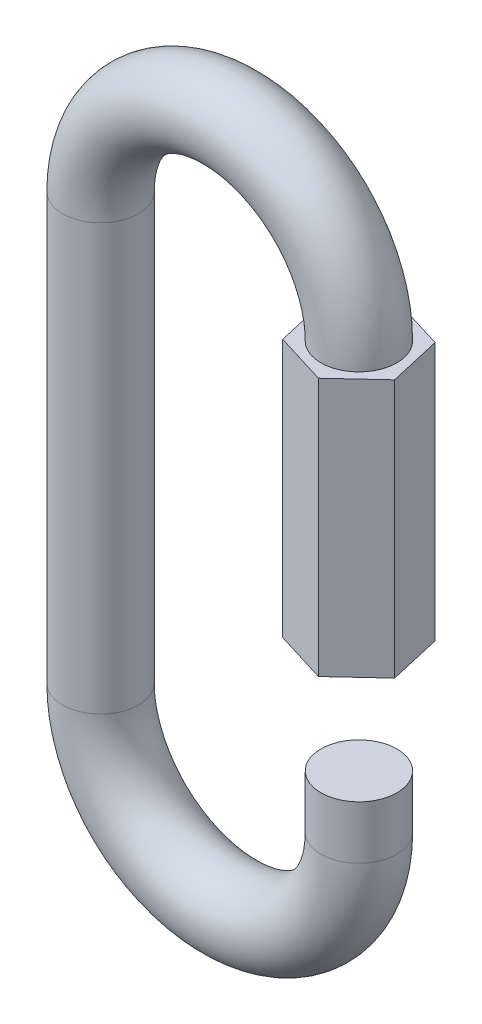
ISO-10303-21;
HEADER;
FILE_DESCRIPTION(('STEP AP214'),'2;1');
FILE_NAME('part.step','',(''),(''),'','','');
FILE_SCHEMA(('AUTOMOTIVE_DESIGN { 1 0 10303 214 1 1 1 1 }'));
ENDSEC;
DATA;
#1=APPLICATION_CONTEXT('core data for automotive mechanical design processes');
#2=APPLICATION_PROTOCOL_DEFINITION('international standard','automotive_design',2000,#1);
#3=PRODUCT_CONTEXT('',#1,'mechanical');
#4=PRODUCT('Part','Part','',(#3));
#5=PRODUCT_RELATED_PRODUCT_CATEGORY('part','',(#4));
#6=PRODUCT_DEFINITION_FORMATION('','',#4);
#7=PRODUCT_DEFINITION_CONTEXT('part definition',#1,'design');
#8=PRODUCT_DEFINITION('design','',#6,#7);
#9=PRODUCT_DEFINITION_SHAPE('','',#8);
#10=(LENGTH_UNIT() NAMED_UNIT(*) SI_UNIT(.MILLI.,.METRE.));
#11=(NAMED_UNIT(*) PLANE_ANGLE_UNIT() SI_UNIT($,.RADIAN.));
#12=(NAMED_UNIT(*) SI_UNIT($,.STERADIAN.) SOLID_ANGLE_UNIT());
#13=UNCERTAINTY_MEASURE_WITH_UNIT(LENGTH_MEASURE(1.E-05),#10,'distance_accuracy_value','');
#14=(GEOMETRIC_REPRESENTATION_CONTEXT(3) GLOBAL_UNCERTAINTY_ASSIGNED_CONTEXT((#13)) GLOBAL_UNIT_ASSIGNED_CONTEXT((#10,
#11,#12)) REPRESENTATION_CONTEXT('',''));
#15=CARTESIAN_POINT('',(0.,0.,0.));
#16=DIRECTION('',(0.,0.,1.));
#17=DIRECTION('',(1.,0.,0.));
#18=AXIS2_PLACEMENT_3D('',#15,#16,#17);
#19=CARTESIAN_POINT('',(0.,-7.5,0.));
#20=DIRECTION('',(0.,1.,0.));
#21=DIRECTION('',(0.,0.,1.));
#22=AXIS2_PLACEMENT_3D('',#19,#20,#21);
#23=PLANE('',#22);
#24=CARTESIAN_POINT('',(0.,-7.5,0.));
#25=DIRECTION('',(0.,1.,0.));
#26=DIRECTION('',(0.,0.,1.));
#27=AXIS2_PLACEMENT_3D('',#24,#25,#26);
#28=CIRCLE('',#27,2.5);
#29=CARTESIAN_POINT('',(0.,-7.5,2.5));
#30=VERTEX_POINT('',#29);
#31=EDGE_CURVE('E11',#30,#30,#28,.T.);
#32=ORIENTED_EDGE('',*,*,#31,.T.);
#33=EDGE_LOOP('',(#32));
#34=FACE_BOUND('',#33,.T.);
#35=ADVANCED_FACE('F39',(#34),#23,.T.);
#36=CARTESIAN_POINT('',(-8.5,17.,0.));
#37=DIRECTION('',(0.,0.,1.));
#38=DIRECTION('',(1.,0.,0.));
#39=AXIS2_PLACEMENT_3D('',#36,#37,#38);
#40=TOROIDAL_SURFACE('',#39,8.5,2.5);
#41=CARTESIAN_POINT('',(0.,17.,0.));
#42=DIRECTION('',(0.,-1.,0.));
#43=DIRECTION('',(0.,0.,-1.));
#44=AXIS2_PLACEMENT_3D('',#41,#42,#43);
#45=CIRCLE('',#44,2.5);
#46=CARTESIAN_POINT('',(2.5,17.,0.));
#47=VERTEX_POINT('',#46);
#48=EDGE_CURVE('E157',#47,#47,#45,.F.);
#49=CARTESIAN_POINT('',(-17.,17.,0.));
#50=DIRECTION('',(0.,-1.,0.));
#51=DIRECTION('',(0.,0.,1.));
#52=AXIS2_PLACEMENT_3D('',#49,#50,#51);
#53=CIRCLE('',#52,2.5);
#54=CARTESIAN_POINT('',(-19.5,17.,0.));
#55=VERTEX_POINT('',#54);
#56=EDGE_CURVE('E170',#55,#55,#53,.T.);
#57=CARTESIAN_POINT('',(-8.5,17.,0.));
#58=DIRECTION('',(0.,0.,1.));
#59=DIRECTION('',(1.,0.,0.));
#60=AXIS2_PLACEMENT_3D('',#57,#58,#59);
#61=CIRCLE('',#60,11.);
#62=EDGE_CURVE('',#47,#55,#61,.T.);
#63=ORIENTED_EDGE('',*,*,#48,.T.);
#64=ORIENTED_EDGE('',*,*,#56,.F.);
#65=ORIENTED_EDGE('',*,*,#62,.T.);
#66=ORIENTED_EDGE('',*,*,#62,.F.);
#67=EDGE_LOOP('',(#63,#65,#64,#66));
#68=FACE_BOUND('',#67,.T.);
#69=ADVANCED_FACE('F192',(#68),#40,.T.);
#70=CARTESIAN_POINT('',(-17.,17.,0.));
#71=DIRECTION('',(0.,-1.,0.));
#72=DIRECTION('',(1.,0.,0.));
#73=AXIS2_PLACEMENT_3D('',#70,#71,#72);
#74=CYLINDRICAL_SURFACE('',#73,2.5);
#75=CARTESIAN_POINT('',(-17.,-11.,0.));
#76=DIRECTION('',(0.,-1.,0.));
#77=DIRECTION('',(0.,0.,1.));
#78=AXIS2_PLACEMENT_3D('',#75,#76,#77);
#79=CIRCLE('',#78,2.5);
#80=CARTESIAN_POINT('',(-19.5,-11.,0.));
#81=VERTEX_POINT('',#80);
#82=EDGE_CURVE('E174',#81,#81,#79,.T.);
#83=ORIENTED_EDGE('',*,*,#82,.F.);
#84=EDGE_LOOP('',(#83));
#85=FACE_BOUND('',#84,.T.);
#86=ORIENTED_EDGE('',*,*,#56,.T.);
#87=EDGE_LOOP('',(#86));
#88=FACE_BOUND('',#87,.T.);
#89=ADVANCED_FACE('F186',(#85,#88),#74,.T.);
#90=CARTESIAN_POINT('',(-8.49999999999999,-11.,0.));
#91=DIRECTION('',(0.,0.,1.));
#92=DIRECTION('',(1.,0.,0.));
#93=AXIS2_PLACEMENT_3D('',#90,#91,#92);
#94=TOROIDAL_SURFACE('',#93,8.5,2.5);
#95=CARTESIAN_POINT('',(0.,-11.,0.));
#96=DIRECTION('',(0.,1.,0.));
#97=DIRECTION('',(0.,0.,1.));
#98=AXIS2_PLACEMENT_3D('',#95,#96,#97);
#99=CIRCLE('',#98,2.5);
#100=CARTESIAN_POINT('',(2.50000000000001,-11.,0.));
#101=VERTEX_POINT('',#100);
#102=EDGE_CURVE('E49',#101,#101,#99,.T.);
#103=CARTESIAN_POINT('',(-8.49999999999999,-11.,0.));
#104=DIRECTION('',(0.,0.,1.));
#105=DIRECTION('',(1.,0.,0.));
#106=AXIS2_PLACEMENT_3D('',#103,#104,#105);
#107=CIRCLE('',#106,11.);
#108=EDGE_CURVE('',#81,#101,#107,.T.);
#109=ORIENTED_EDGE('',*,*,#82,.T.);
#110=ORIENTED_EDGE('',*,*,#102,.F.);
#111=ORIENTED_EDGE('',*,*,#108,.T.);
#112=ORIENTED_EDGE('',*,*,#108,.F.);
#113=EDGE_LOOP('',(#109,#111,#110,#112));
#114=FACE_BOUND('',#113,.T.);
#115=ADVANCED_FACE('F183',(#114),#94,.T.);
#116=CARTESIAN_POINT('',(0.,-11.,0.));
#117=DIRECTION('',(0.,1.,0.));
#118=DIRECTION('',(-1.,0.,0.));
#119=AXIS2_PLACEMENT_3D('',#116,#117,#118);
#120=CYLINDRICAL_SURFACE('',#119,2.5);
#121=ORIENTED_EDGE('',*,*,#31,.F.);
#122=EDGE_LOOP('',(#121));
#123=FACE_BOUND('',#122,.T.);
#124=ORIENTED_EDGE('',*,*,#102,.T.);
#125=EDGE_LOOP('',(#124));
#126=FACE_BOUND('',#125,.T.);
#127=ADVANCED_FACE('F181',(#123,#126),#120,.T.);
#128=CARTESIAN_POINT('',(2.59924143110394,17.,-2.41483397914392));
#129=DIRECTION('',(0.974785628522451,0.,-0.223143403277108));
#130=DIRECTION('',(-0.223143403277108,0.,-0.974785628522451));
#131=AXIS2_PLACEMENT_3D('',#128,#129,#130);
#132=PLANE('',#131);
#133=DIRECTION('',(0.223143403277108,0.,0.974785628522451));
#134=VECTOR('',#133,1.);
#135=CARTESIAN_POINT('',(2.59924143110394,0.,-2.41483397914392));
#136=LINE('',#135,#134);
#137=CARTESIAN_POINT('',(2.59924143110394,0.,-2.41483397914392));
#138=VERTEX_POINT('',#137);
#139=CARTESIAN_POINT('',(3.39092828741247,0.,1.04359212033307));
#140=VERTEX_POINT('',#139);
#141=EDGE_CURVE('E133',#138,#140,#136,.T.);
#142=ORIENTED_EDGE('',*,*,#141,.F.);
#143=DIRECTION('',(0.,-1.,0.));
#144=VECTOR('',#143,1.);
#145=CARTESIAN_POINT('',(2.59924143110394,17.,-2.41483397914392));
#146=LINE('',#145,#144);
#147=CARTESIAN_POINT('',(2.59924143110394,17.,-2.41483397914392));
#148=VERTEX_POINT('',#147);
#149=EDGE_CURVE('E57',#148,#138,#146,.T.);
#150=ORIENTED_EDGE('',*,*,#149,.F.);
#151=DIRECTION('',(0.223143403277108,0.,0.974785628522451));
#152=VECTOR('',#151,1.);
#153=CARTESIAN_POINT('',(2.59924143110394,17.,-2.41483397914392));
#154=LINE('',#153,#152);
#155=CARTESIAN_POINT('',(3.39092828741247,17.,1.04359212033307));
#156=VERTEX_POINT('',#155);
#157=EDGE_CURVE('E154',#148,#156,#154,.T.);
#158=ORIENTED_EDGE('',*,*,#157,.T.);
#159=DIRECTION('',(0.,-1.,0.));
#160=VECTOR('',#159,1.);
#161=CARTESIAN_POINT('',(3.39092828741247,17.,1.04359212033307));
#162=LINE('',#161,#160);
#163=EDGE_CURVE('E92',#156,#140,#162,.T.);
#164=ORIENTED_EDGE('',*,*,#163,.T.);
#165=EDGE_LOOP('',(#142,#150,#158,#164));
#166=FACE_BOUND('',#165,.T.);
#167=ADVANCED_FACE('F213',(#166),#132,.T.);
#168=CARTESIAN_POINT('',(-0.791686856308526,17.,-3.45842609947699));
#169=DIRECTION('',(0.294144958336334,0.,-0.955760819182978));
#170=DIRECTION('',(-0.955760819182978,0.,-0.294144958336334));
#171=AXIS2_PLACEMENT_3D('',#168,#169,#170);
#172=PLANE('',#171);
#173=DIRECTION('',(0.955760819182978,0.,0.294144958336334));
#174=VECTOR('',#173,1.);
#175=CARTESIAN_POINT('',(-0.791686856308526,0.,-3.45842609947699));
#176=LINE('',#175,#174);
#177=CARTESIAN_POINT('',(-0.791686856308526,0.,-3.45842609947699));
#178=VERTEX_POINT('',#177);
#179=EDGE_CURVE('E150',#178,#138,#176,.T.);
#180=ORIENTED_EDGE('',*,*,#179,.F.);
#181=DIRECTION('',(0.,-1.,0.));
#182=VECTOR('',#181,1.);
#183=CARTESIAN_POINT('',(-0.791686856308526,17.,-3.45842609947699));
#184=LINE('',#183,#182);
#185=CARTESIAN_POINT('',(-0.791686856308526,17.,-3.45842609947699));
#186=VERTEX_POINT('',#185);
#187=EDGE_CURVE('E80',#186,#178,#184,.T.);
#188=ORIENTED_EDGE('',*,*,#187,.F.);
#189=DIRECTION('',(0.955760819182978,0.,0.294144958336334));
#190=VECTOR('',#189,1.);
#191=CARTESIAN_POINT('',(-0.791686856308526,17.,-3.45842609947699));
#192=LINE('',#191,#190);
#193=EDGE_CURVE('E119',#186,#148,#192,.T.);
#194=ORIENTED_EDGE('',*,*,#193,.T.);
#195=ORIENTED_EDGE('',*,*,#149,.T.);
#196=EDGE_LOOP('',(#180,#188,#194,#195));
#197=FACE_BOUND('',#196,.T.);
#198=ADVANCED_FACE('F219',(#197),#172,.T.);
#199=CARTESIAN_POINT('',(-3.39092828741247,17.,-1.04359212033307));
#200=DIRECTION('',(-0.680640670186117,0.,-0.732617415905869));
#201=DIRECTION('',(-0.732617415905869,0.,0.680640670186117));
#202=AXIS2_PLACEMENT_3D('',#199,#200,#201);
#203=PLANE('',#202);
#204=DIRECTION('',(0.732617415905869,0.,-0.680640670186117));
#205=VECTOR('',#204,1.);
#206=CARTESIAN_POINT('',(-3.39092828741247,0.,-1.04359212033307));
#207=LINE('',#206,#205);
#208=CARTESIAN_POINT('',(-3.39092828741247,0.,-1.04359212033307));
#209=VERTEX_POINT('',#208);
#210=EDGE_CURVE('E105',#209,#178,#207,.T.);
#211=ORIENTED_EDGE('',*,*,#210,.F.);
#212=DIRECTION('',(0.,-1.,0.));
#213=VECTOR('',#212,1.);
#214=CARTESIAN_POINT('',(-3.39092828741247,17.,-1.04359212033307));
#215=LINE('',#214,#213);
#216=CARTESIAN_POINT('',(-3.39092828741247,17.,-1.04359212033307));
#217=VERTEX_POINT('',#216);
#218=EDGE_CURVE('E100',#217,#209,#215,.T.);
#219=ORIENTED_EDGE('',*,*,#218,.F.);
#220=DIRECTION('',(0.732617415905869,0.,-0.680640670186117));
#221=VECTOR('',#220,1.);
#222=CARTESIAN_POINT('',(-3.39092828741247,17.,-1.04359212033307));
#223=LINE('',#222,#221);
#224=EDGE_CURVE('E103',#217,#186,#223,.T.);
#225=ORIENTED_EDGE('',*,*,#224,.T.);
#226=ORIENTED_EDGE('',*,*,#187,.T.);
#227=EDGE_LOOP('',(#211,#219,#225,#226));
#228=FACE_BOUND('',#227,.T.);
#229=ADVANCED_FACE('F102',(#228),#203,.T.);
#230=CARTESIAN_POINT('',(-2.59924143110394,17.,2.41483397914392));
#231=DIRECTION('',(-0.974785628522451,0.,0.223143403277108));
#232=DIRECTION('',(0.223143403277108,0.,0.974785628522451));
#233=AXIS2_PLACEMENT_3D('',#230,#231,#232);
#234=PLANE('',#233);
#235=DIRECTION('',(-0.223143403277108,0.,-0.974785628522451));
#236=VECTOR('',#235,1.);
#237=CARTESIAN_POINT('',(-2.59924143110394,0.,2.41483397914392));
#238=LINE('',#237,#236);
#239=CARTESIAN_POINT('',(-2.59924143110394,0.,2.41483397914392));
#240=VERTEX_POINT('',#239);
#241=EDGE_CURVE('E145',#240,#209,#238,.T.);
#242=ORIENTED_EDGE('',*,*,#241,.F.);
#243=DIRECTION('',(0.,-1.,0.));
#244=VECTOR('',#243,1.);
#245=CARTESIAN_POINT('',(-2.59924143110394,17.,2.41483397914392));
#246=LINE('',#245,#244);
#247=CARTESIAN_POINT('',(-2.59924143110394,17.,2.41483397914392));
#248=VERTEX_POINT('',#247);
#249=EDGE_CURVE('E111',#248,#240,#246,.T.);
#250=ORIENTED_EDGE('',*,*,#249,.F.);
#251=DIRECTION('',(-0.223143403277108,0.,-0.974785628522451));
#252=VECTOR('',#251,1.);
#253=CARTESIAN_POINT('',(-2.59924143110394,17.,2.41483397914392));
#254=LINE('',#253,#252);
#255=EDGE_CURVE('E117',#248,#217,#254,.T.);
#256=ORIENTED_EDGE('',*,*,#255,.T.);
#257=ORIENTED_EDGE('',*,*,#218,.T.);
#258=EDGE_LOOP('',(#242,#250,#256,#257));
#259=FACE_BOUND('',#258,.T.);
#260=ADVANCED_FACE('F122',(#259),#234,.T.);
#261=CARTESIAN_POINT('',(0.791686856308529,17.,3.45842609947699));
#262=DIRECTION('',(-0.294144958336334,0.,0.955760819182978));
#263=DIRECTION('',(0.955760819182978,0.,0.294144958336334));
#264=AXIS2_PLACEMENT_3D('',#261,#262,#263);
#265=PLANE('',#264);
#266=DIRECTION('',(-0.955760819182978,0.,-0.294144958336334));
#267=VECTOR('',#266,1.);
#268=CARTESIAN_POINT('',(0.791686856308529,0.,3.45842609947699));
#269=LINE('',#268,#267);
#270=CARTESIAN_POINT('',(0.791686856308529,0.,3.45842609947699));
#271=VERTEX_POINT('',#270);
#272=EDGE_CURVE('E141',#271,#240,#269,.T.);
#273=ORIENTED_EDGE('',*,*,#272,.F.);
#274=DIRECTION('',(0.,-1.,0.));
#275=VECTOR('',#274,1.);
#276=CARTESIAN_POINT('',(0.791686856308529,17.,3.45842609947699));
#277=LINE('',#276,#275);
#278=CARTESIAN_POINT('',(0.791686856308529,17.,3.45842609947699));
#279=VERTEX_POINT('',#278);
#280=EDGE_CURVE('E162',#279,#271,#277,.T.);
#281=ORIENTED_EDGE('',*,*,#280,.F.);
#282=DIRECTION('',(-0.955760819182978,0.,-0.294144958336334));
#283=VECTOR('',#282,1.);
#284=CARTESIAN_POINT('',(0.791686856308529,17.,3.45842609947699));
#285=LINE('',#284,#283);
#286=EDGE_CURVE('E124',#279,#248,#285,.T.);
#287=ORIENTED_EDGE('',*,*,#286,.T.);
#288=ORIENTED_EDGE('',*,*,#249,.T.);
#289=EDGE_LOOP('',(#273,#281,#287,#288));
#290=FACE_BOUND('',#289,.T.);
#291=ADVANCED_FACE('F209',(#290),#265,.T.);
#292=CARTESIAN_POINT('',(3.39092828741247,17.,1.04359212033307));
#293=DIRECTION('',(0.680640670186117,0.,0.732617415905869));
#294=DIRECTION('',(0.732617415905869,0.,-0.680640670186117));
#295=AXIS2_PLACEMENT_3D('',#292,#293,#294);
#296=PLANE('',#295);
#297=DIRECTION('',(-0.732617415905869,0.,0.680640670186117));
#298=VECTOR('',#297,1.);
#299=CARTESIAN_POINT('',(3.39092828741247,0.,1.04359212033307));
#300=LINE('',#299,#298);
#301=EDGE_CURVE('E137',#140,#271,#300,.T.);
#302=ORIENTED_EDGE('',*,*,#301,.F.);
#303=ORIENTED_EDGE('',*,*,#163,.F.);
#304=DIRECTION('',(-0.732617415905869,0.,0.680640670186117));
#305=VECTOR('',#304,1.);
#306=CARTESIAN_POINT('',(3.39092828741247,17.,1.04359212033307));
#307=LINE('',#306,#305);
#308=EDGE_CURVE('E127',#156,#279,#307,.T.);
#309=ORIENTED_EDGE('',*,*,#308,.T.);
#310=ORIENTED_EDGE('',*,*,#280,.T.);
#311=EDGE_LOOP('',(#302,#303,#309,#310));
#312=FACE_BOUND('',#311,.T.);
#313=ADVANCED_FACE('F202',(#312),#296,.T.);
#314=CARTESIAN_POINT('',(0.,17.,0.));
#315=DIRECTION('',(0.,-1.,0.));
#316=DIRECTION('',(0.,0.,-1.));
#317=AXIS2_PLACEMENT_3D('',#314,#315,#316);
#318=PLANE('',#317);
#319=ORIENTED_EDGE('',*,*,#48,.F.);
#320=EDGE_LOOP('',(#319));
#321=FACE_BOUND('',#320,.T.);
#322=ORIENTED_EDGE('',*,*,#157,.F.);
#323=ORIENTED_EDGE('',*,*,#193,.F.);
#324=ORIENTED_EDGE('',*,*,#224,.F.);
#325=ORIENTED_EDGE('',*,*,#255,.F.);
#326=ORIENTED_EDGE('',*,*,#286,.F.);
#327=ORIENTED_EDGE('',*,*,#308,.F.);
#328=EDGE_LOOP('',(#322,#323,#324,#325,#326,#327));
#329=FACE_BOUND('',#328,.T.);
#330=ADVANCED_FACE('F115',(#321,#329),#318,.F.);
#331=CARTESIAN_POINT('',(0.,0.,0.));
#332=DIRECTION('',(0.,1.,0.));
#333=DIRECTION('',(0.,0.,1.));
#334=AXIS2_PLACEMENT_3D('',#331,#332,#333);
#335=PLANE('',#334);
#336=ORIENTED_EDGE('',*,*,#141,.T.);
#337=ORIENTED_EDGE('',*,*,#301,.T.);
#338=ORIENTED_EDGE('',*,*,#272,.T.);
#339=ORIENTED_EDGE('',*,*,#241,.T.);
#340=ORIENTED_EDGE('',*,*,#210,.T.);
#341=ORIENTED_EDGE('',*,*,#179,.T.);
#342=EDGE_LOOP('',(#336,#337,#338,#339,#340,#341));
#343=FACE_BOUND('',#342,.T.);
#344=ADVANCED_FACE('F41',(#343),#335,.F.);
#345=CLOSED_SHELL('',(#35,#69,#89,#115,#127,#167,#198,#229,#260,#291,#313,#330,#344));
#346=MANIFOLD_SOLID_BREP('B2',#345);
#347=ADVANCED_BREP_SHAPE_REPRESENTATION('',(#18,#346),#14);
#348=SHAPE_DEFINITION_REPRESENTATION(#9,#347);
ENDSEC;
END-ISO-10303-21;
